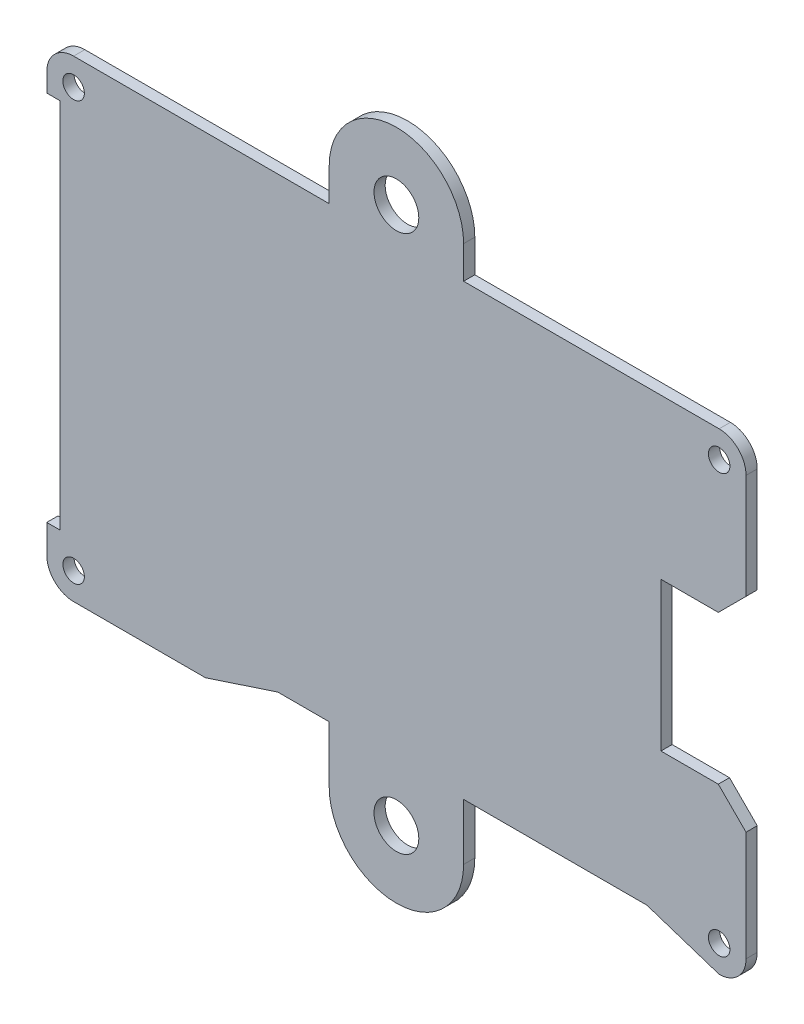
ISO-10303-21;
HEADER;
FILE_DESCRIPTION(('STEP AP214'),'2;1');
FILE_NAME('part.step','',(''),(''),'','','');
FILE_SCHEMA(('AUTOMOTIVE_DESIGN { 1 0 10303 214 1 1 1 1 }'));
ENDSEC;
DATA;
#1=APPLICATION_CONTEXT('core data for automotive mechanical design processes');
#2=APPLICATION_PROTOCOL_DEFINITION('international standard','automotive_design',2000,#1);
#3=PRODUCT_CONTEXT('',#1,'mechanical');
#4=PRODUCT('Part','Part','',(#3));
#5=PRODUCT_RELATED_PRODUCT_CATEGORY('part','',(#4));
#6=PRODUCT_DEFINITION_FORMATION('','',#4);
#7=PRODUCT_DEFINITION_CONTEXT('part definition',#1,'design');
#8=PRODUCT_DEFINITION('design','',#6,#7);
#9=PRODUCT_DEFINITION_SHAPE('','',#8);
#10=(LENGTH_UNIT() NAMED_UNIT(*) SI_UNIT(.MILLI.,.METRE.));
#11=(NAMED_UNIT(*) PLANE_ANGLE_UNIT() SI_UNIT($,.RADIAN.));
#12=(NAMED_UNIT(*) SI_UNIT($,.STERADIAN.) SOLID_ANGLE_UNIT());
#13=UNCERTAINTY_MEASURE_WITH_UNIT(LENGTH_MEASURE(1.E-05),#10,'distance_accuracy_value','');
#14=(GEOMETRIC_REPRESENTATION_CONTEXT(3) GLOBAL_UNCERTAINTY_ASSIGNED_CONTEXT((#13)) GLOBAL_UNIT_ASSIGNED_CONTEXT((#10,
#11,#12)) REPRESENTATION_CONTEXT('',''));
#15=CARTESIAN_POINT('',(0.,0.,0.));
#16=DIRECTION('',(0.,0.,1.));
#17=DIRECTION('',(1.,0.,0.));
#18=AXIS2_PLACEMENT_3D('',#15,#16,#17);
#19=CARTESIAN_POINT('',(-368.3165,91.1883,1.5875));
#20=DIRECTION('',(0.,1.,0.));
#21=DIRECTION('',(-1.,0.,0.));
#22=AXIS2_PLACEMENT_3D('',#19,#20,#21);
#23=PLANE('',#22);
#24=DIRECTION('',(0.,0.,1.));
#25=VECTOR('',#24,1.);
#26=CARTESIAN_POINT('',(-361.0272,91.1883,0.));
#27=LINE('',#26,#25);
#28=CARTESIAN_POINT('',(-361.0272,91.1883,0.));
#29=VERTEX_POINT('',#28);
#30=CARTESIAN_POINT('',(-361.0272,91.1883,1.5875));
#31=VERTEX_POINT('',#30);
#32=EDGE_CURVE('E322',#29,#31,#27,.T.);
#33=ORIENTED_EDGE('',*,*,#32,.T.);
#34=DIRECTION('',(1.,0.,0.));
#35=VECTOR('',#34,1.);
#36=CARTESIAN_POINT('',(-368.3165,91.1883,1.5875));
#37=LINE('',#36,#35);
#38=CARTESIAN_POINT('',(-368.3165,91.1883,1.5875));
#39=VERTEX_POINT('',#38);
#40=EDGE_CURVE('E394',#39,#31,#37,.T.);
#41=ORIENTED_EDGE('',*,*,#40,.F.);
#42=DIRECTION('',(0.,0.,-1.));
#43=VECTOR('',#42,1.);
#44=CARTESIAN_POINT('',(-368.3165,91.1883,1.5875));
#45=LINE('',#44,#43);
#46=CARTESIAN_POINT('',(-368.3165,91.1883,0.));
#47=VERTEX_POINT('',#46);
#48=EDGE_CURVE('E444',#39,#47,#45,.T.);
#49=ORIENTED_EDGE('',*,*,#48,.T.);
#50=DIRECTION('',(1.,0.,0.));
#51=VECTOR('',#50,1.);
#52=CARTESIAN_POINT('',(-368.3165,91.1883,0.));
#53=LINE('',#52,#51);
#54=EDGE_CURVE('E430',#47,#29,#53,.T.);
#55=ORIENTED_EDGE('',*,*,#54,.T.);
#56=EDGE_LOOP('',(#33,#41,#49,#55));
#57=FACE_BOUND('',#56,.T.);
#58=ADVANCED_FACE('F35',(#57),#23,.F.);
#59=CARTESIAN_POINT('',(-305.7573,154.7804,1.5875));
#60=DIRECTION('',(0.,-1.,0.));
#61=DIRECTION('',(1.,0.,0.));
#62=AXIS2_PLACEMENT_3D('',#59,#60,#61);
#63=PLANE('',#62);
#64=DIRECTION('',(0.,0.,1.));
#65=VECTOR('',#64,1.);
#66=CARTESIAN_POINT('',(-361.0272,154.7804,0.));
#67=LINE('',#66,#65);
#68=CARTESIAN_POINT('',(-361.0272,154.7804,0.));
#69=VERTEX_POINT('',#68);
#70=CARTESIAN_POINT('',(-361.0272,154.7804,1.5875));
#71=VERTEX_POINT('',#70);
#72=EDGE_CURVE('E358',#69,#71,#67,.T.);
#73=ORIENTED_EDGE('',*,*,#72,.F.);
#74=DIRECTION('',(-1.,0.,0.));
#75=VECTOR('',#74,1.);
#76=CARTESIAN_POINT('',(-305.7573,154.7804,0.));
#77=LINE('',#76,#75);
#78=CARTESIAN_POINT('',(-397.247125,154.7804,0.));
#79=VERTEX_POINT('',#78);
#80=EDGE_CURVE('E407',#69,#79,#77,.T.);
#81=ORIENTED_EDGE('',*,*,#80,.T.);
#82=DIRECTION('',(0.,0.,-1.));
#83=VECTOR('',#82,1.);
#84=CARTESIAN_POINT('',(-397.247125,154.7804,1.5875));
#85=LINE('',#84,#83);
#86=CARTESIAN_POINT('',(-397.247125,154.7804,1.5875));
#87=VERTEX_POINT('',#86);
#88=EDGE_CURVE('E471',#87,#79,#85,.T.);
#89=ORIENTED_EDGE('',*,*,#88,.F.);
#90=DIRECTION('',(-1.,0.,0.));
#91=VECTOR('',#90,1.);
#92=CARTESIAN_POINT('',(-305.7573,154.7804,1.5875));
#93=LINE('',#92,#91);
#94=EDGE_CURVE('E371',#71,#87,#93,.T.);
#95=ORIENTED_EDGE('',*,*,#94,.F.);
#96=EDGE_LOOP('',(#73,#81,#89,#95));
#97=FACE_BOUND('',#96,.T.);
#98=ADVANCED_FACE('F587',(#97),#63,.F.);
#99=CARTESIAN_POINT('',(-305.7573,150.9704,1.5875));
#100=DIRECTION('',(0.,0.,1.));
#101=DIRECTION('',(1.,0.,0.));
#102=AXIS2_PLACEMENT_3D('',#99,#100,#101);
#103=PLANE('',#102);
#104=DIRECTION('',(0.707106781186555,-0.70710678118654,0.));
#105=VECTOR('',#104,1.);
#106=CARTESIAN_POINT('',(-305.87795,111.1051,1.5875));
#107=LINE('',#106,#105);
#108=CARTESIAN_POINT('',(-305.87795,111.1051,1.5875));
#109=VERTEX_POINT('',#108);
#110=CARTESIAN_POINT('',(-301.9473,107.17445,1.5875));
#111=VERTEX_POINT('',#110);
#112=EDGE_CURVE('E251',#109,#111,#107,.T.);
#113=ORIENTED_EDGE('',*,*,#112,.F.);
#114=DIRECTION('',(1.,0.,0.));
#115=VECTOR('',#114,1.);
#116=CARTESIAN_POINT('',(-314.0123,111.1051,1.5875));
#117=LINE('',#116,#115);
#118=CARTESIAN_POINT('',(-314.0123,111.1051,1.5875));
#119=VERTEX_POINT('',#118);
#120=EDGE_CURVE('E253',#119,#109,#117,.T.);
#121=ORIENTED_EDGE('',*,*,#120,.F.);
#122=DIRECTION('',(0.,-1.,0.));
#123=VECTOR('',#122,1.);
#124=CARTESIAN_POINT('',(-314.0123,132.1871,1.5875));
#125=LINE('',#124,#123);
#126=CARTESIAN_POINT('',(-314.0123,132.1871,1.5875));
#127=VERTEX_POINT('',#126);
#128=EDGE_CURVE('E265',#127,#119,#125,.T.);
#129=ORIENTED_EDGE('',*,*,#128,.F.);
#130=DIRECTION('',(-1.,0.,0.));
#131=VECTOR('',#130,1.);
#132=CARTESIAN_POINT('',(-305.87795,132.1871,1.5875));
#133=LINE('',#132,#131);
#134=CARTESIAN_POINT('',(-305.87795,132.1871,1.5875));
#135=VERTEX_POINT('',#134);
#136=EDGE_CURVE('E263',#135,#127,#133,.T.);
#137=ORIENTED_EDGE('',*,*,#136,.F.);
#138=DIRECTION('',(-0.707106781186552,-0.707106781186542,0.));
#139=VECTOR('',#138,1.);
#140=CARTESIAN_POINT('',(-301.9473,136.11775,1.5875));
#141=LINE('',#140,#139);
#142=CARTESIAN_POINT('',(-301.9473,136.11775,1.5875));
#143=VERTEX_POINT('',#142);
#144=EDGE_CURVE('E229',#143,#135,#141,.T.);
#145=ORIENTED_EDGE('',*,*,#144,.F.);
#146=DIRECTION('',(0.,1.,0.));
#147=VECTOR('',#146,1.);
#148=CARTESIAN_POINT('',(-301.9473,132.81575,1.5875));
#149=LINE('',#148,#147);
#150=CARTESIAN_POINT('',(-301.9473,150.9704,1.5875));
#151=VERTEX_POINT('',#150);
#152=EDGE_CURVE('E366',#143,#151,#149,.T.);
#153=ORIENTED_EDGE('',*,*,#152,.T.);
#154=CARTESIAN_POINT('',(-305.7573,150.9704,1.5875));
#155=DIRECTION('',(0.,0.,1.));
#156=DIRECTION('',(1.,0.,0.));
#157=AXIS2_PLACEMENT_3D('',#154,#155,#156);
#158=CIRCLE('',#157,3.80999999999994);
#159=CARTESIAN_POINT('',(-305.7573,154.7804,1.5875));
#160=VERTEX_POINT('',#159);
#161=EDGE_CURVE('E369',#151,#160,#158,.T.);
#162=ORIENTED_EDGE('',*,*,#161,.T.);
#163=CARTESIAN_POINT('',(-341.9772,154.7804,1.5875));
#164=VERTEX_POINT('',#163);
#165=EDGE_CURVE('E372',#160,#164,#93,.T.);
#166=ORIENTED_EDGE('',*,*,#165,.T.);
#167=DIRECTION('',(0.,1.,0.));
#168=VECTOR('',#167,1.);
#169=CARTESIAN_POINT('',(-341.9772,0.,1.5875));
#170=LINE('',#169,#168);
#171=CARTESIAN_POINT('',(-341.9772,159.40105,1.5875));
#172=VERTEX_POINT('',#171);
#173=EDGE_CURVE('E346',#164,#172,#170,.T.);
#174=ORIENTED_EDGE('',*,*,#173,.T.);
#175=CARTESIAN_POINT('',(-351.5022,159.40105,1.5875));
#176=DIRECTION('',(0.,0.,1.));
#177=DIRECTION('',(1.,0.,0.));
#178=AXIS2_PLACEMENT_3D('',#175,#176,#177);
#179=CIRCLE('',#178,9.52500000000001);
#180=CARTESIAN_POINT('',(-361.0272,159.40105,1.5875));
#181=VERTEX_POINT('',#180);
#182=EDGE_CURVE('E349',#172,#181,#179,.T.);
#183=ORIENTED_EDGE('',*,*,#182,.T.);
#184=DIRECTION('',(0.,1.,0.));
#185=VECTOR('',#184,1.);
#186=CARTESIAN_POINT('',(-361.0272,0.,1.5875));
#187=LINE('',#186,#185);
#188=EDGE_CURVE('E335',#71,#181,#187,.T.);
#189=ORIENTED_EDGE('',*,*,#188,.F.);
#190=ORIENTED_EDGE('',*,*,#94,.T.);
#191=CARTESIAN_POINT('',(-397.247125,150.9704,1.5875));
#192=DIRECTION('',(0.,0.,1.));
#193=DIRECTION('',(1.,0.,0.));
#194=AXIS2_PLACEMENT_3D('',#191,#192,#193);
#195=CIRCLE('',#194,3.81000000000001);
#196=CARTESIAN_POINT('',(-401.0571,150.956597848903,1.5875));
#197=VERTEX_POINT('',#196);
#198=EDGE_CURVE('E375',#87,#197,#195,.T.);
#199=ORIENTED_EDGE('',*,*,#198,.T.);
#200=DIRECTION('',(0.,-1.,0.));
#201=VECTOR('',#200,1.);
#202=CARTESIAN_POINT('',(-401.0571,150.956597848903,1.5875));
#203=LINE('',#202,#201);
#204=CARTESIAN_POINT('',(-401.0571,148.341,1.5875));
#205=VERTEX_POINT('',#204);
#206=EDGE_CURVE('E377',#197,#205,#203,.T.);
#207=ORIENTED_EDGE('',*,*,#206,.T.);
#208=DIRECTION('',(1.,0.,0.));
#209=VECTOR('',#208,1.);
#210=CARTESIAN_POINT('',(-401.0571,148.341,1.5875));
#211=LINE('',#210,#209);
#212=CARTESIAN_POINT('',(-399.1521,148.341,1.5875));
#213=VERTEX_POINT('',#212);
#214=EDGE_CURVE('E379',#205,#213,#211,.T.);
#215=ORIENTED_EDGE('',*,*,#214,.T.);
#216=DIRECTION('',(0.,-1.,0.));
#217=VECTOR('',#216,1.);
#218=CARTESIAN_POINT('',(-399.1521,148.341,1.5875));
#219=LINE('',#218,#217);
#220=CARTESIAN_POINT('',(-399.1521,95.6449,1.5875));
#221=VERTEX_POINT('',#220);
#222=EDGE_CURVE('E381',#213,#221,#219,.T.);
#223=ORIENTED_EDGE('',*,*,#222,.T.);
#224=DIRECTION('',(-1.,0.,0.));
#225=VECTOR('',#224,1.);
#226=CARTESIAN_POINT('',(-399.1521,95.6449,1.5875));
#227=LINE('',#226,#225);
#228=CARTESIAN_POINT('',(-401.0571,95.6449,1.5875));
#229=VERTEX_POINT('',#228);
#230=EDGE_CURVE('E383',#221,#229,#227,.T.);
#231=ORIENTED_EDGE('',*,*,#230,.T.);
#232=DIRECTION('',(0.,-1.,0.));
#233=VECTOR('',#232,1.);
#234=CARTESIAN_POINT('',(-401.0571,95.6449,1.5875));
#235=LINE('',#234,#233);
#236=CARTESIAN_POINT('',(-401.0571,91.6593041663556,1.5875));
#237=VERTEX_POINT('',#236);
#238=EDGE_CURVE('E385',#229,#237,#235,.T.);
#239=ORIENTED_EDGE('',*,*,#238,.T.);
#240=CARTESIAN_POINT('',(-397.2472,91.6317,1.5875));
#241=DIRECTION('',(0.,0.,1.));
#242=DIRECTION('',(1.,0.,0.));
#243=AXIS2_PLACEMENT_3D('',#240,#241,#242);
#244=CIRCLE('',#243,3.81);
#245=CARTESIAN_POINT('',(-397.2472,87.8217,1.5875));
#246=VERTEX_POINT('',#245);
#247=EDGE_CURVE('E387',#237,#246,#244,.T.);
#248=ORIENTED_EDGE('',*,*,#247,.T.);
#249=DIRECTION('',(1.,0.,0.));
#250=VECTOR('',#249,1.);
#251=CARTESIAN_POINT('',(-397.2472,87.8217,1.5875));
#252=LINE('',#251,#250);
#253=CARTESIAN_POINT('',(-378.5565,87.8217,1.5875));
#254=VERTEX_POINT('',#253);
#255=EDGE_CURVE('E389',#246,#254,#252,.T.);
#256=ORIENTED_EDGE('',*,*,#255,.T.);
#257=DIRECTION('',(0.949975924247208,0.312323139313538,0.));
#258=VECTOR('',#257,1.);
#259=CARTESIAN_POINT('',(-378.5565,87.8217,1.5875));
#260=LINE('',#259,#258);
#261=EDGE_CURVE('E391',#254,#39,#260,.T.);
#262=ORIENTED_EDGE('',*,*,#261,.T.);
#263=ORIENTED_EDGE('',*,*,#40,.T.);
#264=DIRECTION('',(0.,1.,0.));
#265=VECTOR('',#264,1.);
#266=CARTESIAN_POINT('',(-361.0272,0.,1.5875));
#267=LINE('',#266,#265);
#268=CARTESIAN_POINT('',(-361.0272,83.20105,1.5875));
#269=VERTEX_POINT('',#268);
#270=EDGE_CURVE('E317',#269,#31,#267,.T.);
#271=ORIENTED_EDGE('',*,*,#270,.F.);
#272=CARTESIAN_POINT('',(-351.5022,83.20105,1.5875));
#273=DIRECTION('',(0.,0.,1.));
#274=DIRECTION('',(1.,0.,0.));
#275=AXIS2_PLACEMENT_3D('',#272,#273,#274);
#276=CIRCLE('',#275,9.52500000000001);
#277=CARTESIAN_POINT('',(-341.9772,83.20105,1.5875));
#278=VERTEX_POINT('',#277);
#279=EDGE_CURVE('E319',#269,#278,#276,.T.);
#280=ORIENTED_EDGE('',*,*,#279,.T.);
#281=DIRECTION('',(0.,1.,0.));
#282=VECTOR('',#281,1.);
#283=CARTESIAN_POINT('',(-341.9772,0.,1.5875));
#284=LINE('',#283,#282);
#285=CARTESIAN_POINT('',(-341.9772,91.1883,1.5875));
#286=VERTEX_POINT('',#285);
#287=EDGE_CURVE('E58',#278,#286,#284,.T.);
#288=ORIENTED_EDGE('',*,*,#287,.T.);
#289=CARTESIAN_POINT('',(-315.9973,91.1883,1.5875));
#290=VERTEX_POINT('',#289);
#291=EDGE_CURVE('E393',#286,#290,#37,.T.);
#292=ORIENTED_EDGE('',*,*,#291,.T.);
#293=DIRECTION('',(0.949975924247207,-0.312323139313541,0.));
#294=VECTOR('',#293,1.);
#295=CARTESIAN_POINT('',(-315.9973,91.1883,1.5875));
#296=LINE('',#295,#294);
#297=CARTESIAN_POINT('',(-305.7573,87.8217,1.5875));
#298=VERTEX_POINT('',#297);
#299=EDGE_CURVE('E397',#290,#298,#296,.T.);
#300=ORIENTED_EDGE('',*,*,#299,.T.);
#301=CARTESIAN_POINT('',(-305.7573,91.6317,1.5875));
#302=DIRECTION('',(0.,0.,1.));
#303=DIRECTION('',(1.,0.,0.));
#304=AXIS2_PLACEMENT_3D('',#301,#302,#303);
#305=CIRCLE('',#304,3.81);
#306=CARTESIAN_POINT('',(-301.9473,91.6317,1.5875));
#307=VERTEX_POINT('',#306);
#308=EDGE_CURVE('E399',#298,#307,#305,.T.);
#309=ORIENTED_EDGE('',*,*,#308,.T.);
#310=DIRECTION('',(0.,1.,0.));
#311=VECTOR('',#310,1.);
#312=CARTESIAN_POINT('',(-301.9473,91.6317,1.5875));
#313=LINE('',#312,#311);
#314=EDGE_CURVE('E363',#307,#111,#313,.T.);
#315=ORIENTED_EDGE('',*,*,#314,.T.);
#316=EDGE_LOOP('',(#113,#121,#129,#137,#145,#153,#162,#166,#174,#183,#189,#190,#199,#207,#215,
#223,#231,#239,#248,#256,#262,#263,#271,#280,#288,#292,#300,#309,#315));
#317=FACE_BOUND('',#316,.T.);
#318=CARTESIAN_POINT('',(-397.2472,91.6317,1.5875));
#319=DIRECTION('',(0.,0.,1.));
#320=DIRECTION('',(1.,0.,0.));
#321=AXIS2_PLACEMENT_3D('',#318,#319,#320);
#322=CIRCLE('',#321,1.52400000000001);
#323=CARTESIAN_POINT('',(-395.7232,91.6317,1.5875));
#324=VERTEX_POINT('',#323);
#325=EDGE_CURVE('E272',#324,#324,#322,.T.);
#326=ORIENTED_EDGE('',*,*,#325,.F.);
#327=EDGE_LOOP('',(#326));
#328=FACE_BOUND('',#327,.T.);
#329=CARTESIAN_POINT('',(-305.7573,91.6317,1.5875));
#330=DIRECTION('',(0.,0.,1.));
#331=DIRECTION('',(1.,0.,0.));
#332=AXIS2_PLACEMENT_3D('',#329,#330,#331);
#333=CIRCLE('',#332,1.52400000000001);
#334=CARTESIAN_POINT('',(-304.2333,91.6317,1.5875));
#335=VERTEX_POINT('',#334);
#336=EDGE_CURVE('E283',#335,#335,#333,.T.);
#337=ORIENTED_EDGE('',*,*,#336,.F.);
#338=EDGE_LOOP('',(#337));
#339=FACE_BOUND('',#338,.T.);
#340=CARTESIAN_POINT('',(-305.7573,150.9704,1.5875));
#341=DIRECTION('',(0.,0.,1.));
#342=DIRECTION('',(1.,0.,0.));
#343=AXIS2_PLACEMENT_3D('',#340,#341,#342);
#344=CIRCLE('',#343,1.52400000000001);
#345=CARTESIAN_POINT('',(-304.2333,150.9704,1.5875));
#346=VERTEX_POINT('',#345);
#347=EDGE_CURVE('E289',#346,#346,#344,.T.);
#348=ORIENTED_EDGE('',*,*,#347,.F.);
#349=EDGE_LOOP('',(#348));
#350=FACE_BOUND('',#349,.T.);
#351=CARTESIAN_POINT('',(-397.247125,150.9704,1.5875));
#352=DIRECTION('',(0.,0.,1.));
#353=DIRECTION('',(1.,0.,0.));
#354=AXIS2_PLACEMENT_3D('',#351,#352,#353);
#355=CIRCLE('',#354,1.52400000000001);
#356=CARTESIAN_POINT('',(-395.723125,150.9704,1.5875));
#357=VERTEX_POINT('',#356);
#358=EDGE_CURVE('E295',#357,#357,#355,.T.);
#359=ORIENTED_EDGE('',*,*,#358,.F.);
#360=EDGE_LOOP('',(#359));
#361=FACE_BOUND('',#360,.T.);
#362=CARTESIAN_POINT('',(-351.5022,159.40105,1.5875));
#363=DIRECTION('',(0.,0.,1.));
#364=DIRECTION('',(1.,0.,0.));
#365=AXIS2_PLACEMENT_3D('',#362,#363,#364);
#366=CIRCLE('',#365,3.17499999999997);
#367=CARTESIAN_POINT('',(-348.3272,159.40105,1.5875));
#368=VERTEX_POINT('',#367);
#369=EDGE_CURVE('E325',#368,#368,#366,.T.);
#370=ORIENTED_EDGE('',*,*,#369,.F.);
#371=EDGE_LOOP('',(#370));
#372=FACE_BOUND('',#371,.T.);
#373=CARTESIAN_POINT('',(-351.5022,83.20105,1.5875));
#374=DIRECTION('',(0.,0.,1.));
#375=DIRECTION('',(1.,0.,0.));
#376=AXIS2_PLACEMENT_3D('',#373,#374,#375);
#377=CIRCLE('',#376,3.17499999999997);
#378=CARTESIAN_POINT('',(-348.3272,83.20105,1.5875));
#379=VERTEX_POINT('',#378);
#380=EDGE_CURVE('E301',#379,#379,#377,.T.);
#381=ORIENTED_EDGE('',*,*,#380,.F.);
#382=EDGE_LOOP('',(#381));
#383=FACE_BOUND('',#382,.T.);
#384=ADVANCED_FACE('F487',(#317,#328,#339,#350,#361,#372,#383),#103,.T.);
#385=CARTESIAN_POINT('',(-305.7573,150.9704,0.));
#386=DIRECTION('',(0.,0.,1.));
#387=DIRECTION('',(1.,0.,0.));
#388=AXIS2_PLACEMENT_3D('',#385,#386,#387);
#389=PLANE('',#388);
#390=CARTESIAN_POINT('',(-397.2472,91.6317,0.));
#391=DIRECTION('',(0.,0.,1.));
#392=DIRECTION('',(1.,0.,0.));
#393=AXIS2_PLACEMENT_3D('',#390,#391,#392);
#394=CIRCLE('',#393,1.52400000000001);
#395=CARTESIAN_POINT('',(-395.7232,91.6317,0.));
#396=VERTEX_POINT('',#395);
#397=EDGE_CURVE('E280',#396,#396,#394,.T.);
#398=ORIENTED_EDGE('',*,*,#397,.T.);
#399=EDGE_LOOP('',(#398));
#400=FACE_BOUND('',#399,.T.);
#401=CARTESIAN_POINT('',(-305.7573,91.6317,0.));
#402=DIRECTION('',(0.,0.,1.));
#403=DIRECTION('',(1.,0.,0.));
#404=AXIS2_PLACEMENT_3D('',#401,#402,#403);
#405=CIRCLE('',#404,1.52400000000001);
#406=CARTESIAN_POINT('',(-304.2333,91.6317,0.));
#407=VERTEX_POINT('',#406);
#408=EDGE_CURVE('E286',#407,#407,#405,.T.);
#409=ORIENTED_EDGE('',*,*,#408,.T.);
#410=EDGE_LOOP('',(#409));
#411=FACE_BOUND('',#410,.T.);
#412=CARTESIAN_POINT('',(-305.7573,150.9704,0.));
#413=DIRECTION('',(0.,0.,1.));
#414=DIRECTION('',(1.,0.,0.));
#415=AXIS2_PLACEMENT_3D('',#412,#413,#414);
#416=CIRCLE('',#415,1.52400000000001);
#417=CARTESIAN_POINT('',(-304.2333,150.9704,0.));
#418=VERTEX_POINT('',#417);
#419=EDGE_CURVE('E292',#418,#418,#416,.T.);
#420=ORIENTED_EDGE('',*,*,#419,.T.);
#421=EDGE_LOOP('',(#420));
#422=FACE_BOUND('',#421,.T.);
#423=CARTESIAN_POINT('',(-397.247125,150.9704,0.));
#424=DIRECTION('',(0.,0.,1.));
#425=DIRECTION('',(1.,0.,0.));
#426=AXIS2_PLACEMENT_3D('',#423,#424,#425);
#427=CIRCLE('',#426,1.52400000000001);
#428=CARTESIAN_POINT('',(-395.723125,150.9704,0.));
#429=VERTEX_POINT('',#428);
#430=EDGE_CURVE('E298',#429,#429,#427,.T.);
#431=ORIENTED_EDGE('',*,*,#430,.T.);
#432=EDGE_LOOP('',(#431));
#433=FACE_BOUND('',#432,.T.);
#434=DIRECTION('',(1.,0.,0.));
#435=VECTOR('',#434,1.);
#436=CARTESIAN_POINT('',(-314.0123,111.1051,0.));
#437=LINE('',#436,#435);
#438=CARTESIAN_POINT('',(-314.0123,111.1051,0.));
#439=VERTEX_POINT('',#438);
#440=CARTESIAN_POINT('',(-305.87795,111.1051,0.));
#441=VERTEX_POINT('',#440);
#442=EDGE_CURVE('E257',#439,#441,#437,.T.);
#443=ORIENTED_EDGE('',*,*,#442,.T.);
#444=DIRECTION('',(0.707106781186555,-0.70710678118654,0.));
#445=VECTOR('',#444,1.);
#446=CARTESIAN_POINT('',(-305.87795,111.1051,0.));
#447=LINE('',#446,#445);
#448=CARTESIAN_POINT('',(-301.9473,107.17445,0.));
#449=VERTEX_POINT('',#448);
#450=EDGE_CURVE('E259',#441,#449,#447,.T.);
#451=ORIENTED_EDGE('',*,*,#450,.T.);
#452=DIRECTION('',(0.,1.,0.));
#453=VECTOR('',#452,1.);
#454=CARTESIAN_POINT('',(-301.9473,91.6317,0.));
#455=LINE('',#454,#453);
#456=CARTESIAN_POINT('',(-301.9473,91.6317,0.));
#457=VERTEX_POINT('',#456);
#458=EDGE_CURVE('E357',#457,#449,#455,.T.);
#459=ORIENTED_EDGE('',*,*,#458,.F.);
#460=CARTESIAN_POINT('',(-305.7573,91.6317,0.));
#461=DIRECTION('',(0.,0.,1.));
#462=DIRECTION('',(1.,0.,0.));
#463=AXIS2_PLACEMENT_3D('',#460,#461,#462);
#464=CIRCLE('',#463,3.81);
#465=CARTESIAN_POINT('',(-305.7573,87.8217,0.));
#466=VERTEX_POINT('',#465);
#467=EDGE_CURVE('E367',#466,#457,#464,.T.);
#468=ORIENTED_EDGE('',*,*,#467,.F.);
#469=DIRECTION('',(0.949975924247207,-0.312323139313541,0.));
#470=VECTOR('',#469,1.);
#471=CARTESIAN_POINT('',(-315.9973,91.1883,0.));
#472=LINE('',#471,#470);
#473=CARTESIAN_POINT('',(-315.9973,91.1883,0.));
#474=VERTEX_POINT('',#473);
#475=EDGE_CURVE('E433',#474,#466,#472,.T.);
#476=ORIENTED_EDGE('',*,*,#475,.F.);
#477=CARTESIAN_POINT('',(-341.9772,91.1883,0.));
#478=VERTEX_POINT('',#477);
#479=EDGE_CURVE('E429',#478,#474,#53,.T.);
#480=ORIENTED_EDGE('',*,*,#479,.F.);
#481=DIRECTION('',(0.,1.,0.));
#482=VECTOR('',#481,1.);
#483=CARTESIAN_POINT('',(-341.9772,0.,0.));
#484=LINE('',#483,#482);
#485=CARTESIAN_POINT('',(-341.9772,83.20105,0.));
#486=VERTEX_POINT('',#485);
#487=EDGE_CURVE('E312',#486,#478,#484,.T.);
#488=ORIENTED_EDGE('',*,*,#487,.F.);
#489=CARTESIAN_POINT('',(-351.5022,83.20105,0.));
#490=DIRECTION('',(0.,0.,1.));
#491=DIRECTION('',(1.,0.,0.));
#492=AXIS2_PLACEMENT_3D('',#489,#490,#491);
#493=CIRCLE('',#492,9.52500000000001);
#494=CARTESIAN_POINT('',(-361.0272,83.20105,0.));
#495=VERTEX_POINT('',#494);
#496=EDGE_CURVE('E309',#495,#486,#493,.T.);
#497=ORIENTED_EDGE('',*,*,#496,.F.);
#498=DIRECTION('',(0.,1.,0.));
#499=VECTOR('',#498,1.);
#500=CARTESIAN_POINT('',(-361.0272,0.,0.));
#501=LINE('',#500,#499);
#502=EDGE_CURVE('E307',#495,#29,#501,.T.);
#503=ORIENTED_EDGE('',*,*,#502,.T.);
#504=ORIENTED_EDGE('',*,*,#54,.F.);
#505=DIRECTION('',(0.949975924247208,0.312323139313538,0.));
#506=VECTOR('',#505,1.);
#507=CARTESIAN_POINT('',(-378.5565,87.8217,0.));
#508=LINE('',#507,#506);
#509=CARTESIAN_POINT('',(-378.5565,87.8217,0.));
#510=VERTEX_POINT('',#509);
#511=EDGE_CURVE('E427',#510,#47,#508,.T.);
#512=ORIENTED_EDGE('',*,*,#511,.F.);
#513=DIRECTION('',(1.,0.,0.));
#514=VECTOR('',#513,1.);
#515=CARTESIAN_POINT('',(-397.2472,87.8217,0.));
#516=LINE('',#515,#514);
#517=CARTESIAN_POINT('',(-397.2472,87.8217,0.));
#518=VERTEX_POINT('',#517);
#519=EDGE_CURVE('E425',#518,#510,#516,.T.);
#520=ORIENTED_EDGE('',*,*,#519,.F.);
#521=CARTESIAN_POINT('',(-397.2472,91.6317,0.));
#522=DIRECTION('',(0.,0.,1.));
#523=DIRECTION('',(1.,0.,0.));
#524=AXIS2_PLACEMENT_3D('',#521,#522,#523);
#525=CIRCLE('',#524,3.81);
#526=CARTESIAN_POINT('',(-401.0571,91.6593041663556,0.));
#527=VERTEX_POINT('',#526);
#528=EDGE_CURVE('E423',#527,#518,#525,.T.);
#529=ORIENTED_EDGE('',*,*,#528,.F.);
#530=DIRECTION('',(0.,-1.,0.));
#531=VECTOR('',#530,1.);
#532=CARTESIAN_POINT('',(-401.0571,95.6449,0.));
#533=LINE('',#532,#531);
#534=CARTESIAN_POINT('',(-401.0571,95.6449,0.));
#535=VERTEX_POINT('',#534);
#536=EDGE_CURVE('E421',#535,#527,#533,.T.);
#537=ORIENTED_EDGE('',*,*,#536,.F.);
#538=DIRECTION('',(-1.,0.,0.));
#539=VECTOR('',#538,1.);
#540=CARTESIAN_POINT('',(-399.1521,95.6449,0.));
#541=LINE('',#540,#539);
#542=CARTESIAN_POINT('',(-399.1521,95.6449,0.));
#543=VERTEX_POINT('',#542);
#544=EDGE_CURVE('E419',#543,#535,#541,.T.);
#545=ORIENTED_EDGE('',*,*,#544,.F.);
#546=DIRECTION('',(0.,-1.,0.));
#547=VECTOR('',#546,1.);
#548=CARTESIAN_POINT('',(-399.1521,148.341,0.));
#549=LINE('',#548,#547);
#550=CARTESIAN_POINT('',(-399.1521,148.341,0.));
#551=VERTEX_POINT('',#550);
#552=EDGE_CURVE('E417',#551,#543,#549,.T.);
#553=ORIENTED_EDGE('',*,*,#552,.F.);
#554=DIRECTION('',(1.,0.,0.));
#555=VECTOR('',#554,1.);
#556=CARTESIAN_POINT('',(-401.0571,148.341,0.));
#557=LINE('',#556,#555);
#558=CARTESIAN_POINT('',(-401.0571,148.341,0.));
#559=VERTEX_POINT('',#558);
#560=EDGE_CURVE('E415',#559,#551,#557,.T.);
#561=ORIENTED_EDGE('',*,*,#560,.F.);
#562=DIRECTION('',(0.,-1.,0.));
#563=VECTOR('',#562,1.);
#564=CARTESIAN_POINT('',(-401.0571,150.956597848903,0.));
#565=LINE('',#564,#563);
#566=CARTESIAN_POINT('',(-401.0571,150.956597848903,0.));
#567=VERTEX_POINT('',#566);
#568=EDGE_CURVE('E413',#567,#559,#565,.T.);
#569=ORIENTED_EDGE('',*,*,#568,.F.);
#570=CARTESIAN_POINT('',(-397.247125,150.9704,0.));
#571=DIRECTION('',(0.,0.,1.));
#572=DIRECTION('',(1.,0.,0.));
#573=AXIS2_PLACEMENT_3D('',#570,#571,#572);
#574=CIRCLE('',#573,3.81000000000001);
#575=EDGE_CURVE('E411',#79,#567,#574,.T.);
#576=ORIENTED_EDGE('',*,*,#575,.F.);
#577=ORIENTED_EDGE('',*,*,#80,.F.);
#578=DIRECTION('',(0.,1.,0.));
#579=VECTOR('',#578,1.);
#580=CARTESIAN_POINT('',(-361.0272,0.,0.));
#581=LINE('',#580,#579);
#582=CARTESIAN_POINT('',(-361.0272,159.40105,0.));
#583=VERTEX_POINT('',#582);
#584=EDGE_CURVE('E341',#69,#583,#581,.T.);
#585=ORIENTED_EDGE('',*,*,#584,.T.);
#586=CARTESIAN_POINT('',(-351.5022,159.40105,0.));
#587=DIRECTION('',(0.,0.,1.));
#588=DIRECTION('',(1.,0.,0.));
#589=AXIS2_PLACEMENT_3D('',#586,#587,#588);
#590=CIRCLE('',#589,9.52500000000001);
#591=CARTESIAN_POINT('',(-341.9772,159.40105,0.));
#592=VERTEX_POINT('',#591);
#593=EDGE_CURVE('E338',#592,#583,#590,.T.);
#594=ORIENTED_EDGE('',*,*,#593,.F.);
#595=DIRECTION('',(0.,1.,0.));
#596=VECTOR('',#595,1.);
#597=CARTESIAN_POINT('',(-341.9772,0.,0.));
#598=LINE('',#597,#596);
#599=CARTESIAN_POINT('',(-341.9772,154.7804,0.));
#600=VERTEX_POINT('',#599);
#601=EDGE_CURVE('E334',#600,#592,#598,.T.);
#602=ORIENTED_EDGE('',*,*,#601,.F.);
#603=CARTESIAN_POINT('',(-305.7573,154.7804,0.));
#604=VERTEX_POINT('',#603);
#605=EDGE_CURVE('E408',#604,#600,#77,.T.);
#606=ORIENTED_EDGE('',*,*,#605,.F.);
#607=CARTESIAN_POINT('',(-305.7573,150.9704,0.));
#608=DIRECTION('',(0.,0.,1.));
#609=DIRECTION('',(1.,0.,0.));
#610=AXIS2_PLACEMENT_3D('',#607,#608,#609);
#611=CIRCLE('',#610,3.80999999999994);
#612=CARTESIAN_POINT('',(-301.9473,150.9704,0.));
#613=VERTEX_POINT('',#612);
#614=EDGE_CURVE('E405',#613,#604,#611,.T.);
#615=ORIENTED_EDGE('',*,*,#614,.F.);
#616=DIRECTION('',(0.,1.,0.));
#617=VECTOR('',#616,1.);
#618=CARTESIAN_POINT('',(-301.9473,132.81575,0.));
#619=LINE('',#618,#617);
#620=CARTESIAN_POINT('',(-301.9473,136.11775,0.));
#621=VERTEX_POINT('',#620);
#622=EDGE_CURVE('E250',#621,#613,#619,.T.);
#623=ORIENTED_EDGE('',*,*,#622,.F.);
#624=DIRECTION('',(-0.707106781186552,-0.707106781186542,0.));
#625=VECTOR('',#624,1.);
#626=CARTESIAN_POINT('',(-301.9473,136.11775,0.));
#627=LINE('',#626,#625);
#628=CARTESIAN_POINT('',(-305.87795,132.1871,0.));
#629=VERTEX_POINT('',#628);
#630=EDGE_CURVE('E50',#621,#629,#627,.T.);
#631=ORIENTED_EDGE('',*,*,#630,.T.);
#632=DIRECTION('',(-1.,0.,0.));
#633=VECTOR('',#632,1.);
#634=CARTESIAN_POINT('',(-305.87795,132.1871,0.));
#635=LINE('',#634,#633);
#636=CARTESIAN_POINT('',(-314.0123,132.1871,0.));
#637=VERTEX_POINT('',#636);
#638=EDGE_CURVE('E238',#629,#637,#635,.T.);
#639=ORIENTED_EDGE('',*,*,#638,.T.);
#640=DIRECTION('',(0.,-1.,0.));
#641=VECTOR('',#640,1.);
#642=CARTESIAN_POINT('',(-314.0123,132.1871,0.));
#643=LINE('',#642,#641);
#644=EDGE_CURVE('E243',#637,#439,#643,.T.);
#645=ORIENTED_EDGE('',*,*,#644,.T.);
#646=EDGE_LOOP('',(#443,#451,#459,#468,#476,#480,#488,#497,#503,#504,#512,#520,#529,#537,#545,
#553,#561,#569,#576,#577,#585,#594,#602,#606,#615,#623,#631,#639,#645));
#647=FACE_BOUND('',#646,.T.);
#648=CARTESIAN_POINT('',(-351.5022,159.40105,0.));
#649=DIRECTION('',(0.,0.,1.));
#650=DIRECTION('',(1.,0.,0.));
#651=AXIS2_PLACEMENT_3D('',#648,#649,#650);
#652=CIRCLE('',#651,3.17499999999997);
#653=CARTESIAN_POINT('',(-348.3272,159.40105,0.));
#654=VERTEX_POINT('',#653);
#655=EDGE_CURVE('E331',#654,#654,#652,.T.);
#656=ORIENTED_EDGE('',*,*,#655,.T.);
#657=EDGE_LOOP('',(#656));
#658=FACE_BOUND('',#657,.T.);
#659=CARTESIAN_POINT('',(-351.5022,83.20105,0.));
#660=DIRECTION('',(0.,0.,1.));
#661=DIRECTION('',(1.,0.,0.));
#662=AXIS2_PLACEMENT_3D('',#659,#660,#661);
#663=CIRCLE('',#662,3.17499999999997);
#664=CARTESIAN_POINT('',(-348.3272,83.20105,0.));
#665=VERTEX_POINT('',#664);
#666=EDGE_CURVE('E304',#665,#665,#663,.T.);
#667=ORIENTED_EDGE('',*,*,#666,.T.);
#668=EDGE_LOOP('',(#667));
#669=FACE_BOUND('',#668,.T.);
#670=ADVANCED_FACE('F247',(#400,#411,#422,#433,#647,#658,#669),#389,.F.);
#671=CARTESIAN_POINT('',(-301.9473,91.6317,1.5875));
#672=DIRECTION('',(-1.,0.,0.));
#673=DIRECTION('',(0.,-1.,0.));
#674=AXIS2_PLACEMENT_3D('',#671,#672,#673);
#675=PLANE('',#674);
#676=ORIENTED_EDGE('',*,*,#458,.T.);
#677=DIRECTION('',(0.,0.,1.));
#678=VECTOR('',#677,1.);
#679=CARTESIAN_POINT('',(-301.9473,107.17445,0.));
#680=LINE('',#679,#678);
#681=EDGE_CURVE('E269',#449,#111,#680,.T.);
#682=ORIENTED_EDGE('',*,*,#681,.T.);
#683=ORIENTED_EDGE('',*,*,#314,.F.);
#684=DIRECTION('',(0.,0.,-1.));
#685=VECTOR('',#684,1.);
#686=CARTESIAN_POINT('',(-301.9473,91.6317,1.5875));
#687=LINE('',#686,#685);
#688=EDGE_CURVE('E401',#307,#457,#687,.T.);
#689=ORIENTED_EDGE('',*,*,#688,.T.);
#690=EDGE_LOOP('',(#676,#682,#683,#689));
#691=FACE_BOUND('',#690,.T.);
#692=ADVANCED_FACE('F37',(#691),#675,.F.);
#693=CARTESIAN_POINT('',(-301.9473,132.81575,1.5875));
#694=DIRECTION('',(-1.,0.,0.));
#695=DIRECTION('',(0.,0.,1.));
#696=AXIS2_PLACEMENT_3D('',#693,#694,#695);
#697=PLANE('',#696);
#698=ORIENTED_EDGE('',*,*,#152,.F.);
#699=DIRECTION('',(0.,0.,1.));
#700=VECTOR('',#699,1.);
#701=CARTESIAN_POINT('',(-301.9473,136.11775,0.));
#702=LINE('',#701,#700);
#703=EDGE_CURVE('E234',#621,#143,#702,.T.);
#704=ORIENTED_EDGE('',*,*,#703,.F.);
#705=ORIENTED_EDGE('',*,*,#622,.T.);
#706=DIRECTION('',(0.,0.,-1.));
#707=VECTOR('',#706,1.);
#708=CARTESIAN_POINT('',(-301.9473,150.9704,1.5875));
#709=LINE('',#708,#707);
#710=EDGE_CURVE('E11',#151,#613,#709,.T.);
#711=ORIENTED_EDGE('',*,*,#710,.F.);
#712=EDGE_LOOP('',(#698,#704,#705,#711));
#713=FACE_BOUND('',#712,.T.);
#714=ADVANCED_FACE('F493',(#713),#697,.F.);
#715=CARTESIAN_POINT('',(-305.7573,150.9704,1.5875));
#716=DIRECTION('',(0.,0.,-1.));
#717=DIRECTION('',(-1.,0.,0.));
#718=AXIS2_PLACEMENT_3D('',#715,#716,#717);
#719=CYLINDRICAL_SURFACE('',#718,3.80999999999994);
#720=ORIENTED_EDGE('',*,*,#614,.T.);
#721=DIRECTION('',(0.,0.,-1.));
#722=VECTOR('',#721,1.);
#723=CARTESIAN_POINT('',(-305.7573,154.7804,1.5875));
#724=LINE('',#723,#722);
#725=EDGE_CURVE('E43',#160,#604,#724,.T.);
#726=ORIENTED_EDGE('',*,*,#725,.F.);
#727=ORIENTED_EDGE('',*,*,#161,.F.);
#728=ORIENTED_EDGE('',*,*,#710,.T.);
#729=EDGE_LOOP('',(#720,#726,#727,#728));
#730=FACE_BOUND('',#729,.T.);
#731=ADVANCED_FACE('F491',(#730),#719,.T.);
#732=ORIENTED_EDGE('',*,*,#605,.T.);
#733=DIRECTION('',(0.,0.,1.));
#734=VECTOR('',#733,1.);
#735=CARTESIAN_POINT('',(-341.9772,154.7804,0.));
#736=LINE('',#735,#734);
#737=EDGE_CURVE('E354',#600,#164,#736,.T.);
#738=ORIENTED_EDGE('',*,*,#737,.T.);
#739=ORIENTED_EDGE('',*,*,#165,.F.);
#740=ORIENTED_EDGE('',*,*,#725,.T.);
#741=EDGE_LOOP('',(#732,#738,#739,#740));
#742=FACE_BOUND('',#741,.T.);
#743=ADVANCED_FACE('F478',(#742),#63,.F.);
#744=CARTESIAN_POINT('',(-397.247125,150.9704,1.5875));
#745=DIRECTION('',(0.,0.,-1.));
#746=DIRECTION('',(-1.,0.,0.));
#747=AXIS2_PLACEMENT_3D('',#744,#745,#746);
#748=CYLINDRICAL_SURFACE('',#747,3.81000000000001);
#749=ORIENTED_EDGE('',*,*,#575,.T.);
#750=DIRECTION('',(0.,0.,-1.));
#751=VECTOR('',#750,1.);
#752=CARTESIAN_POINT('',(-401.0571,150.956597848903,1.5875));
#753=LINE('',#752,#751);
#754=EDGE_CURVE('E468',#197,#567,#753,.T.);
#755=ORIENTED_EDGE('',*,*,#754,.F.);
#756=ORIENTED_EDGE('',*,*,#198,.F.);
#757=ORIENTED_EDGE('',*,*,#88,.T.);
#758=EDGE_LOOP('',(#749,#755,#756,#757));
#759=FACE_BOUND('',#758,.T.);
#760=ADVANCED_FACE('F581',(#759),#748,.T.);
#761=CARTESIAN_POINT('',(-401.0571,150.956597848903,1.5875));
#762=DIRECTION('',(1.,0.,0.));
#763=DIRECTION('',(0.,0.,-1.));
#764=AXIS2_PLACEMENT_3D('',#761,#762,#763);
#765=PLANE('',#764);
#766=ORIENTED_EDGE('',*,*,#568,.T.);
#767=DIRECTION('',(0.,0.,-1.));
#768=VECTOR('',#767,1.);
#769=CARTESIAN_POINT('',(-401.0571,148.341,1.5875));
#770=LINE('',#769,#768);
#771=EDGE_CURVE('E465',#205,#559,#770,.T.);
#772=ORIENTED_EDGE('',*,*,#771,.F.);
#773=ORIENTED_EDGE('',*,*,#206,.F.);
#774=ORIENTED_EDGE('',*,*,#754,.T.);
#775=EDGE_LOOP('',(#766,#772,#773,#774));
#776=FACE_BOUND('',#775,.T.);
#777=ADVANCED_FACE('F576',(#776),#765,.F.);
#778=CARTESIAN_POINT('',(-401.0571,148.341,1.5875));
#779=DIRECTION('',(0.,1.,0.));
#780=DIRECTION('',(0.,0.,1.));
#781=AXIS2_PLACEMENT_3D('',#778,#779,#780);
#782=PLANE('',#781);
#783=ORIENTED_EDGE('',*,*,#560,.T.);
#784=DIRECTION('',(0.,0.,-1.));
#785=VECTOR('',#784,1.);
#786=CARTESIAN_POINT('',(-399.1521,148.341,1.5875));
#787=LINE('',#786,#785);
#788=EDGE_CURVE('E462',#213,#551,#787,.T.);
#789=ORIENTED_EDGE('',*,*,#788,.F.);
#790=ORIENTED_EDGE('',*,*,#214,.F.);
#791=ORIENTED_EDGE('',*,*,#771,.T.);
#792=EDGE_LOOP('',(#783,#789,#790,#791));
#793=FACE_BOUND('',#792,.T.);
#794=ADVANCED_FACE('F572',(#793),#782,.F.);
#795=CARTESIAN_POINT('',(-399.1521,148.341,1.5875));
#796=DIRECTION('',(1.,0.,0.));
#797=DIRECTION('',(0.,0.,-1.));
#798=AXIS2_PLACEMENT_3D('',#795,#796,#797);
#799=PLANE('',#798);
#800=ORIENTED_EDGE('',*,*,#552,.T.);
#801=DIRECTION('',(0.,0.,-1.));
#802=VECTOR('',#801,1.);
#803=CARTESIAN_POINT('',(-399.1521,95.6449,1.5875));
#804=LINE('',#803,#802);
#805=EDGE_CURVE('E459',#221,#543,#804,.T.);
#806=ORIENTED_EDGE('',*,*,#805,.F.);
#807=ORIENTED_EDGE('',*,*,#222,.F.);
#808=ORIENTED_EDGE('',*,*,#788,.T.);
#809=EDGE_LOOP('',(#800,#806,#807,#808));
#810=FACE_BOUND('',#809,.T.);
#811=ADVANCED_FACE('F567',(#810),#799,.F.);
#812=CARTESIAN_POINT('',(-399.1521,95.6449,1.5875));
#813=DIRECTION('',(0.,-1.,0.));
#814=DIRECTION('',(0.,0.,-1.));
#815=AXIS2_PLACEMENT_3D('',#812,#813,#814);
#816=PLANE('',#815);
#817=ORIENTED_EDGE('',*,*,#544,.T.);
#818=DIRECTION('',(0.,0.,-1.));
#819=VECTOR('',#818,1.);
#820=CARTESIAN_POINT('',(-401.0571,95.6449,1.5875));
#821=LINE('',#820,#819);
#822=EDGE_CURVE('E456',#229,#535,#821,.T.);
#823=ORIENTED_EDGE('',*,*,#822,.F.);
#824=ORIENTED_EDGE('',*,*,#230,.F.);
#825=ORIENTED_EDGE('',*,*,#805,.T.);
#826=EDGE_LOOP('',(#817,#823,#824,#825));
#827=FACE_BOUND('',#826,.T.);
#828=ADVANCED_FACE('F561',(#827),#816,.F.);
#829=CARTESIAN_POINT('',(-401.0571,95.6449,1.5875));
#830=DIRECTION('',(1.,0.,0.));
#831=DIRECTION('',(0.,0.,-1.));
#832=AXIS2_PLACEMENT_3D('',#829,#830,#831);
#833=PLANE('',#832);
#834=ORIENTED_EDGE('',*,*,#536,.T.);
#835=DIRECTION('',(0.,0.,-1.));
#836=VECTOR('',#835,1.);
#837=CARTESIAN_POINT('',(-401.0571,91.6593041663556,1.5875));
#838=LINE('',#837,#836);
#839=EDGE_CURVE('E453',#237,#527,#838,.T.);
#840=ORIENTED_EDGE('',*,*,#839,.F.);
#841=ORIENTED_EDGE('',*,*,#238,.F.);
#842=ORIENTED_EDGE('',*,*,#822,.T.);
#843=EDGE_LOOP('',(#834,#840,#841,#842));
#844=FACE_BOUND('',#843,.T.);
#845=ADVANCED_FACE('F557',(#844),#833,.F.);
#846=CARTESIAN_POINT('',(-397.2472,91.6317,1.5875));
#847=DIRECTION('',(0.,0.,-1.));
#848=DIRECTION('',(-1.,0.,0.));
#849=AXIS2_PLACEMENT_3D('',#846,#847,#848);
#850=CYLINDRICAL_SURFACE('',#849,3.81);
#851=ORIENTED_EDGE('',*,*,#528,.T.);
#852=DIRECTION('',(0.,0.,-1.));
#853=VECTOR('',#852,1.);
#854=CARTESIAN_POINT('',(-397.2472,87.8217,1.5875));
#855=LINE('',#854,#853);
#856=EDGE_CURVE('E450',#246,#518,#855,.T.);
#857=ORIENTED_EDGE('',*,*,#856,.F.);
#858=ORIENTED_EDGE('',*,*,#247,.F.);
#859=ORIENTED_EDGE('',*,*,#839,.T.);
#860=EDGE_LOOP('',(#851,#857,#858,#859));
#861=FACE_BOUND('',#860,.T.);
#862=ADVANCED_FACE('F552',(#861),#850,.T.);
#863=CARTESIAN_POINT('',(-397.2472,87.8217,1.5875));
#864=DIRECTION('',(0.,1.,0.));
#865=DIRECTION('',(0.,0.,1.));
#866=AXIS2_PLACEMENT_3D('',#863,#864,#865);
#867=PLANE('',#866);
#868=ORIENTED_EDGE('',*,*,#519,.T.);
#869=DIRECTION('',(0.,0.,-1.));
#870=VECTOR('',#869,1.);
#871=CARTESIAN_POINT('',(-378.5565,87.8217,1.5875));
#872=LINE('',#871,#870);
#873=EDGE_CURVE('E447',#254,#510,#872,.T.);
#874=ORIENTED_EDGE('',*,*,#873,.F.);
#875=ORIENTED_EDGE('',*,*,#255,.F.);
#876=ORIENTED_EDGE('',*,*,#856,.T.);
#877=EDGE_LOOP('',(#868,#874,#875,#876));
#878=FACE_BOUND('',#877,.T.);
#879=ADVANCED_FACE('F546',(#878),#867,.F.);
#880=CARTESIAN_POINT('',(-378.5565,87.8217,1.5875));
#881=DIRECTION('',(-0.312323139313538,0.949975924247208,0.));
#882=DIRECTION('',(-0.949975924247208,-0.312323139313538,0.));
#883=AXIS2_PLACEMENT_3D('',#880,#881,#882);
#884=PLANE('',#883);
#885=ORIENTED_EDGE('',*,*,#511,.T.);
#886=ORIENTED_EDGE('',*,*,#48,.F.);
#887=ORIENTED_EDGE('',*,*,#261,.F.);
#888=ORIENTED_EDGE('',*,*,#873,.T.);
#889=EDGE_LOOP('',(#885,#886,#887,#888));
#890=FACE_BOUND('',#889,.T.);
#891=ADVANCED_FACE('F542',(#890),#884,.F.);
#892=ORIENTED_EDGE('',*,*,#291,.F.);
#893=DIRECTION('',(0.,0.,1.));
#894=VECTOR('',#893,1.);
#895=CARTESIAN_POINT('',(-341.9772,91.1883,0.));
#896=LINE('',#895,#894);
#897=EDGE_CURVE('E326',#478,#286,#896,.T.);
#898=ORIENTED_EDGE('',*,*,#897,.F.);
#899=ORIENTED_EDGE('',*,*,#479,.T.);
#900=DIRECTION('',(0.,0.,-1.));
#901=VECTOR('',#900,1.);
#902=CARTESIAN_POINT('',(-315.9973,91.1883,1.5875));
#903=LINE('',#902,#901);
#904=EDGE_CURVE('E441',#290,#474,#903,.T.);
#905=ORIENTED_EDGE('',*,*,#904,.F.);
#906=EDGE_LOOP('',(#892,#898,#899,#905));
#907=FACE_BOUND('',#906,.T.);
#908=ADVANCED_FACE('F521',(#907),#23,.F.);
#909=CARTESIAN_POINT('',(-315.9973,91.1883,1.5875));
#910=DIRECTION('',(0.312323139313541,0.949975924247207,0.));
#911=DIRECTION('',(-0.949975924247207,0.312323139313541,0.));
#912=AXIS2_PLACEMENT_3D('',#909,#910,#911);
#913=PLANE('',#912);
#914=ORIENTED_EDGE('',*,*,#475,.T.);
#915=DIRECTION('',(0.,0.,-1.));
#916=VECTOR('',#915,1.);
#917=CARTESIAN_POINT('',(-305.7573,87.8217,1.5875));
#918=LINE('',#917,#916);
#919=EDGE_CURVE('E438',#298,#466,#918,.T.);
#920=ORIENTED_EDGE('',*,*,#919,.F.);
#921=ORIENTED_EDGE('',*,*,#299,.F.);
#922=ORIENTED_EDGE('',*,*,#904,.T.);
#923=EDGE_LOOP('',(#914,#920,#921,#922));
#924=FACE_BOUND('',#923,.T.);
#925=ADVANCED_FACE('F517',(#924),#913,.F.);
#926=CARTESIAN_POINT('',(-305.7573,91.6317,1.5875));
#927=DIRECTION('',(0.,0.,-1.));
#928=DIRECTION('',(-1.,0.,0.));
#929=AXIS2_PLACEMENT_3D('',#926,#927,#928);
#930=CYLINDRICAL_SURFACE('',#929,3.81);
#931=ORIENTED_EDGE('',*,*,#467,.T.);
#932=ORIENTED_EDGE('',*,*,#688,.F.);
#933=ORIENTED_EDGE('',*,*,#308,.F.);
#934=ORIENTED_EDGE('',*,*,#919,.T.);
#935=EDGE_LOOP('',(#931,#932,#933,#934));
#936=FACE_BOUND('',#935,.T.);
#937=ADVANCED_FACE('F511',(#936),#930,.T.);
#938=CARTESIAN_POINT('',(-341.9772,0.,0.));
#939=DIRECTION('',(1.,0.,0.));
#940=DIRECTION('',(0.,0.,-1.));
#941=AXIS2_PLACEMENT_3D('',#938,#939,#940);
#942=PLANE('',#941);
#943=ORIENTED_EDGE('',*,*,#173,.F.);
#944=ORIENTED_EDGE('',*,*,#737,.F.);
#945=ORIENTED_EDGE('',*,*,#601,.T.);
#946=DIRECTION('',(0.,0.,1.));
#947=VECTOR('',#946,1.);
#948=CARTESIAN_POINT('',(-341.9772,159.40105,0.));
#949=LINE('',#948,#947);
#950=EDGE_CURVE('E343',#592,#172,#949,.T.);
#951=ORIENTED_EDGE('',*,*,#950,.T.);
#952=EDGE_LOOP('',(#943,#944,#945,#951));
#953=FACE_BOUND('',#952,.T.);
#954=ADVANCED_FACE('F484',(#953),#942,.T.);
#955=CARTESIAN_POINT('',(-361.0272,0.,0.));
#956=DIRECTION('',(1.,0.,0.));
#957=DIRECTION('',(0.,0.,-1.));
#958=AXIS2_PLACEMENT_3D('',#955,#956,#957);
#959=PLANE('',#958);
#960=ORIENTED_EDGE('',*,*,#188,.T.);
#961=DIRECTION('',(0.,0.,1.));
#962=VECTOR('',#961,1.);
#963=CARTESIAN_POINT('',(-361.0272,159.40105,0.));
#964=LINE('',#963,#962);
#965=EDGE_CURVE('E360',#583,#181,#964,.T.);
#966=ORIENTED_EDGE('',*,*,#965,.F.);
#967=ORIENTED_EDGE('',*,*,#584,.F.);
#968=ORIENTED_EDGE('',*,*,#72,.T.);
#969=EDGE_LOOP('',(#960,#966,#967,#968));
#970=FACE_BOUND('',#969,.T.);
#971=ADVANCED_FACE('F590',(#970),#959,.F.);
#972=CARTESIAN_POINT('',(-351.5022,159.40105,0.));
#973=DIRECTION('',(0.,0.,1.));
#974=DIRECTION('',(1.,0.,0.));
#975=AXIS2_PLACEMENT_3D('',#972,#973,#974);
#976=CYLINDRICAL_SURFACE('',#975,3.17499999999997);
#977=ORIENTED_EDGE('',*,*,#655,.F.);
#978=EDGE_LOOP('',(#977));
#979=FACE_BOUND('',#978,.T.);
#980=ORIENTED_EDGE('',*,*,#369,.T.);
#981=EDGE_LOOP('',(#980));
#982=FACE_BOUND('',#981,.T.);
#983=ADVANCED_FACE('F595',(#979,#982),#976,.F.);
#984=CARTESIAN_POINT('',(-351.5022,159.40105,0.));
#985=DIRECTION('',(0.,0.,1.));
#986=DIRECTION('',(1.,0.,0.));
#987=AXIS2_PLACEMENT_3D('',#984,#985,#986);
#988=CYLINDRICAL_SURFACE('',#987,9.52500000000001);
#989=ORIENTED_EDGE('',*,*,#182,.F.);
#990=ORIENTED_EDGE('',*,*,#950,.F.);
#991=ORIENTED_EDGE('',*,*,#593,.T.);
#992=ORIENTED_EDGE('',*,*,#965,.T.);
#993=EDGE_LOOP('',(#989,#990,#991,#992));
#994=FACE_BOUND('',#993,.T.);
#995=ADVANCED_FACE('F593',(#994),#988,.T.);
#996=CARTESIAN_POINT('',(-361.0272,0.,0.));
#997=DIRECTION('',(1.,0.,0.));
#998=DIRECTION('',(0.,0.,-1.));
#999=AXIS2_PLACEMENT_3D('',#996,#997,#998);
#1000=PLANE('',#999);
#1001=ORIENTED_EDGE('',*,*,#270,.T.);
#1002=ORIENTED_EDGE('',*,*,#32,.F.);
#1003=ORIENTED_EDGE('',*,*,#502,.F.);
#1004=DIRECTION('',(0.,0.,1.));
#1005=VECTOR('',#1004,1.);
#1006=CARTESIAN_POINT('',(-361.0272,83.20105,0.));
#1007=LINE('',#1006,#1005);
#1008=EDGE_CURVE('E314',#495,#269,#1007,.T.);
#1009=ORIENTED_EDGE('',*,*,#1008,.T.);
#1010=EDGE_LOOP('',(#1001,#1002,#1003,#1009));
#1011=FACE_BOUND('',#1010,.T.);
#1012=ADVANCED_FACE('F533',(#1011),#1000,.F.);
#1013=CARTESIAN_POINT('',(-341.9772,0.,0.));
#1014=DIRECTION('',(1.,0.,0.));
#1015=DIRECTION('',(0.,0.,-1.));
#1016=AXIS2_PLACEMENT_3D('',#1013,#1014,#1015);
#1017=PLANE('',#1016);
#1018=ORIENTED_EDGE('',*,*,#287,.F.);
#1019=DIRECTION('',(0.,0.,1.));
#1020=VECTOR('',#1019,1.);
#1021=CARTESIAN_POINT('',(-341.9772,83.20105,0.));
#1022=LINE('',#1021,#1020);
#1023=EDGE_CURVE('E328',#486,#278,#1022,.T.);
#1024=ORIENTED_EDGE('',*,*,#1023,.F.);
#1025=ORIENTED_EDGE('',*,*,#487,.T.);
#1026=ORIENTED_EDGE('',*,*,#897,.T.);
#1027=EDGE_LOOP('',(#1018,#1024,#1025,#1026));
#1028=FACE_BOUND('',#1027,.T.);
#1029=ADVANCED_FACE('F524',(#1028),#1017,.T.);
#1030=CARTESIAN_POINT('',(-351.5022,83.20105,0.));
#1031=DIRECTION('',(0.,0.,1.));
#1032=DIRECTION('',(1.,0.,0.));
#1033=AXIS2_PLACEMENT_3D('',#1030,#1031,#1032);
#1034=CYLINDRICAL_SURFACE('',#1033,3.17499999999997);
#1035=ORIENTED_EDGE('',*,*,#666,.F.);
#1036=EDGE_LOOP('',(#1035));
#1037=FACE_BOUND('',#1036,.T.);
#1038=ORIENTED_EDGE('',*,*,#380,.T.);
#1039=EDGE_LOOP('',(#1038));
#1040=FACE_BOUND('',#1039,.T.);
#1041=ADVANCED_FACE('F665',(#1037,#1040),#1034,.F.);
#1042=CARTESIAN_POINT('',(-351.5022,83.20105,0.));
#1043=DIRECTION('',(0.,0.,1.));
#1044=DIRECTION('',(1.,0.,0.));
#1045=AXIS2_PLACEMENT_3D('',#1042,#1043,#1044);
#1046=CYLINDRICAL_SURFACE('',#1045,9.52500000000001);
#1047=ORIENTED_EDGE('',*,*,#279,.F.);
#1048=ORIENTED_EDGE('',*,*,#1008,.F.);
#1049=ORIENTED_EDGE('',*,*,#496,.T.);
#1050=ORIENTED_EDGE('',*,*,#1023,.T.);
#1051=EDGE_LOOP('',(#1047,#1048,#1049,#1050));
#1052=FACE_BOUND('',#1051,.T.);
#1053=ADVANCED_FACE('F528',(#1052),#1046,.T.);
#1054=CARTESIAN_POINT('',(-397.247125,150.9704,0.));
#1055=DIRECTION('',(0.,0.,1.));
#1056=DIRECTION('',(1.,0.,0.));
#1057=AXIS2_PLACEMENT_3D('',#1054,#1055,#1056);
#1058=CYLINDRICAL_SURFACE('',#1057,1.52400000000001);
#1059=ORIENTED_EDGE('',*,*,#430,.F.);
#1060=EDGE_LOOP('',(#1059));
#1061=FACE_BOUND('',#1060,.T.);
#1062=ORIENTED_EDGE('',*,*,#358,.T.);
#1063=EDGE_LOOP('',(#1062));
#1064=FACE_BOUND('',#1063,.T.);
#1065=ADVANCED_FACE('F671',(#1061,#1064),#1058,.F.);
#1066=CARTESIAN_POINT('',(-305.7573,150.9704,0.));
#1067=DIRECTION('',(0.,0.,1.));
#1068=DIRECTION('',(1.,0.,0.));
#1069=AXIS2_PLACEMENT_3D('',#1066,#1067,#1068);
#1070=CYLINDRICAL_SURFACE('',#1069,1.52400000000001);
#1071=ORIENTED_EDGE('',*,*,#419,.F.);
#1072=EDGE_LOOP('',(#1071));
#1073=FACE_BOUND('',#1072,.T.);
#1074=ORIENTED_EDGE('',*,*,#347,.T.);
#1075=EDGE_LOOP('',(#1074));
#1076=FACE_BOUND('',#1075,.T.);
#1077=ADVANCED_FACE('F676',(#1073,#1076),#1070,.F.);
#1078=CARTESIAN_POINT('',(-305.7573,91.6317,0.));
#1079=DIRECTION('',(0.,0.,1.));
#1080=DIRECTION('',(1.,0.,0.));
#1081=AXIS2_PLACEMENT_3D('',#1078,#1079,#1080);
#1082=CYLINDRICAL_SURFACE('',#1081,1.52400000000001);
#1083=ORIENTED_EDGE('',*,*,#408,.F.);
#1084=EDGE_LOOP('',(#1083));
#1085=FACE_BOUND('',#1084,.T.);
#1086=ORIENTED_EDGE('',*,*,#336,.T.);
#1087=EDGE_LOOP('',(#1086));
#1088=FACE_BOUND('',#1087,.T.);
#1089=ADVANCED_FACE('F680',(#1085,#1088),#1082,.F.);
#1090=CARTESIAN_POINT('',(-397.2472,91.6317,0.));
#1091=DIRECTION('',(0.,0.,1.));
#1092=DIRECTION('',(1.,0.,0.));
#1093=AXIS2_PLACEMENT_3D('',#1090,#1091,#1092);
#1094=CYLINDRICAL_SURFACE('',#1093,1.52400000000001);
#1095=ORIENTED_EDGE('',*,*,#397,.F.);
#1096=EDGE_LOOP('',(#1095));
#1097=FACE_BOUND('',#1096,.T.);
#1098=ORIENTED_EDGE('',*,*,#325,.T.);
#1099=EDGE_LOOP('',(#1098));
#1100=FACE_BOUND('',#1099,.T.);
#1101=ADVANCED_FACE('F684',(#1097,#1100),#1094,.F.);
#1102=CARTESIAN_POINT('',(-301.9473,136.11775,0.));
#1103=DIRECTION('',(-0.707106781186542,0.707106781186552,0.));
#1104=DIRECTION('',(-0.707106781186553,-0.707106781186543,0.));
#1105=AXIS2_PLACEMENT_3D('',#1102,#1103,#1104);
#1106=PLANE('',#1105);
#1107=ORIENTED_EDGE('',*,*,#144,.T.);
#1108=DIRECTION('',(0.,0.,1.));
#1109=VECTOR('',#1108,1.);
#1110=CARTESIAN_POINT('',(-305.87795,132.1871,0.));
#1111=LINE('',#1110,#1109);
#1112=EDGE_CURVE('E225',#629,#135,#1111,.T.);
#1113=ORIENTED_EDGE('',*,*,#1112,.F.);
#1114=ORIENTED_EDGE('',*,*,#630,.F.);
#1115=ORIENTED_EDGE('',*,*,#703,.T.);
#1116=EDGE_LOOP('',(#1107,#1113,#1114,#1115));
#1117=FACE_BOUND('',#1116,.T.);
#1118=ADVANCED_FACE('F227',(#1117),#1106,.F.);
#1119=CARTESIAN_POINT('',(-305.87795,132.1871,0.));
#1120=DIRECTION('',(0.,1.,0.));
#1121=DIRECTION('',(0.,0.,1.));
#1122=AXIS2_PLACEMENT_3D('',#1119,#1120,#1121);
#1123=PLANE('',#1122);
#1124=ORIENTED_EDGE('',*,*,#136,.T.);
#1125=DIRECTION('',(0.,0.,1.));
#1126=VECTOR('',#1125,1.);
#1127=CARTESIAN_POINT('',(-314.0123,132.1871,0.));
#1128=LINE('',#1127,#1126);
#1129=EDGE_CURVE('E233',#637,#127,#1128,.T.);
#1130=ORIENTED_EDGE('',*,*,#1129,.F.);
#1131=ORIENTED_EDGE('',*,*,#638,.F.);
#1132=ORIENTED_EDGE('',*,*,#1112,.T.);
#1133=EDGE_LOOP('',(#1124,#1130,#1131,#1132));
#1134=FACE_BOUND('',#1133,.T.);
#1135=ADVANCED_FACE('F239',(#1134),#1123,.F.);
#1136=CARTESIAN_POINT('',(-314.0123,132.1871,0.));
#1137=DIRECTION('',(-1.,0.,0.));
#1138=DIRECTION('',(0.,0.,1.));
#1139=AXIS2_PLACEMENT_3D('',#1136,#1137,#1138);
#1140=PLANE('',#1139);
#1141=ORIENTED_EDGE('',*,*,#128,.T.);
#1142=DIRECTION('',(0.,0.,1.));
#1143=VECTOR('',#1142,1.);
#1144=CARTESIAN_POINT('',(-314.0123,111.1051,0.));
#1145=LINE('',#1144,#1143);
#1146=EDGE_CURVE('E275',#439,#119,#1145,.T.);
#1147=ORIENTED_EDGE('',*,*,#1146,.F.);
#1148=ORIENTED_EDGE('',*,*,#644,.F.);
#1149=ORIENTED_EDGE('',*,*,#1129,.T.);
#1150=EDGE_LOOP('',(#1141,#1147,#1148,#1149));
#1151=FACE_BOUND('',#1150,.T.);
#1152=ADVANCED_FACE('F496',(#1151),#1140,.F.);
#1153=CARTESIAN_POINT('',(-305.87795,111.1051,0.));
#1154=DIRECTION('',(-0.70710678118654,-0.707106781186555,0.));
#1155=DIRECTION('',(0.707106781186555,-0.70710678118654,0.));
#1156=AXIS2_PLACEMENT_3D('',#1153,#1154,#1155);
#1157=PLANE('',#1156);
#1158=ORIENTED_EDGE('',*,*,#112,.T.);
#1159=ORIENTED_EDGE('',*,*,#681,.F.);
#1160=ORIENTED_EDGE('',*,*,#450,.F.);
#1161=DIRECTION('',(0.,0.,1.));
#1162=VECTOR('',#1161,1.);
#1163=CARTESIAN_POINT('',(-305.87795,111.1051,0.));
#1164=LINE('',#1163,#1162);
#1165=EDGE_CURVE('E273',#441,#109,#1164,.T.);
#1166=ORIENTED_EDGE('',*,*,#1165,.T.);
#1167=EDGE_LOOP('',(#1158,#1159,#1160,#1166));
#1168=FACE_BOUND('',#1167,.T.);
#1169=ADVANCED_FACE('F503',(#1168),#1157,.F.);
#1170=CARTESIAN_POINT('',(-314.0123,111.1051,0.));
#1171=DIRECTION('',(0.,-1.,0.));
#1172=DIRECTION('',(0.,0.,-1.));
#1173=AXIS2_PLACEMENT_3D('',#1170,#1171,#1172);
#1174=PLANE('',#1173);
#1175=ORIENTED_EDGE('',*,*,#120,.T.);
#1176=ORIENTED_EDGE('',*,*,#1165,.F.);
#1177=ORIENTED_EDGE('',*,*,#442,.F.);
#1178=ORIENTED_EDGE('',*,*,#1146,.T.);
#1179=EDGE_LOOP('',(#1175,#1176,#1177,#1178));
#1180=FACE_BOUND('',#1179,.T.);
#1181=ADVANCED_FACE('F501',(#1180),#1174,.F.);
#1182=CLOSED_SHELL('',(#58,#98,#384,#670,#692,#714,#731,#743,#760,#777,#794,#811,#828,#845,#862,
#879,#891,#908,#925,#937,#954,#971,#983,#995,#1012,#1029,#1041,#1053,#1065,#1077,#1089,#1101,
#1118,#1135,#1152,#1169,#1181));
#1183=MANIFOLD_SOLID_BREP('B2',#1182);
#1184=ADVANCED_BREP_SHAPE_REPRESENTATION('',(#18,#1183),#14);
#1185=SHAPE_DEFINITION_REPRESENTATION(#9,#1184);
ENDSEC;
END-ISO-10303-21;
